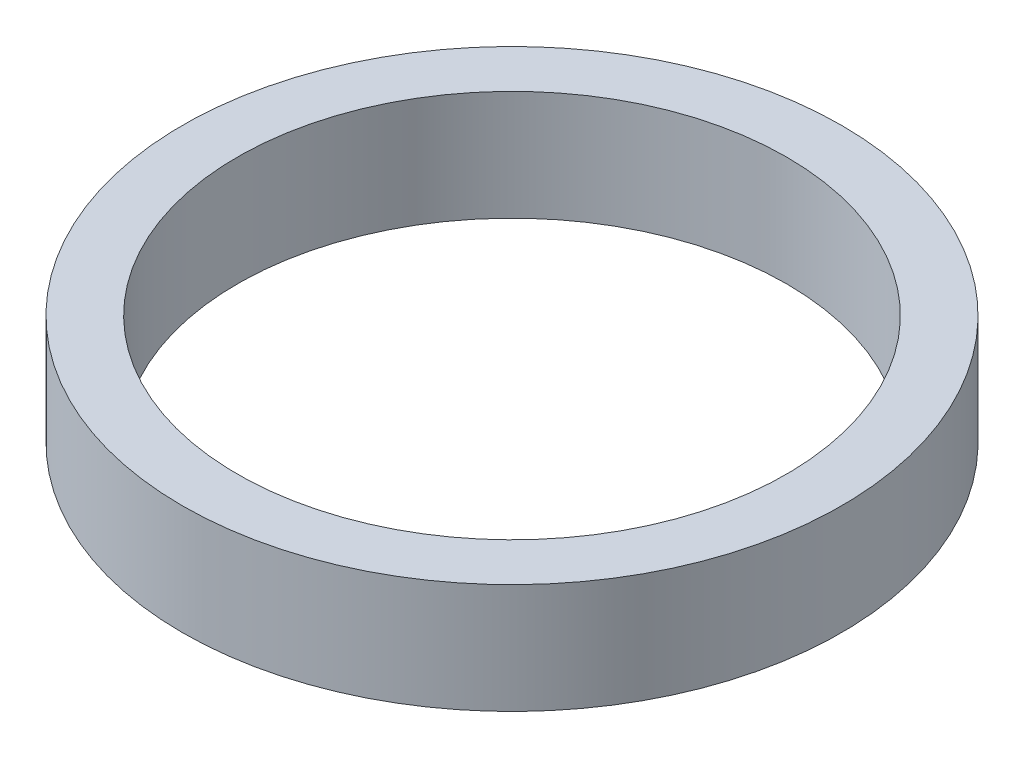
ISO-10303-21;
HEADER;
FILE_DESCRIPTION(('STEP AP214'),'2;1');
FILE_NAME('part.step','',(''),(''),'','','');
FILE_SCHEMA(('AUTOMOTIVE_DESIGN { 1 0 10303 214 1 1 1 1 }'));
ENDSEC;
DATA;
#1=APPLICATION_CONTEXT('core data for automotive mechanical design processes');
#2=APPLICATION_PROTOCOL_DEFINITION('international standard','automotive_design',2000,#1);
#3=PRODUCT_CONTEXT('',#1,'mechanical');
#4=PRODUCT('Part','Part','',(#3));
#5=PRODUCT_RELATED_PRODUCT_CATEGORY('part','',(#4));
#6=PRODUCT_DEFINITION_FORMATION('','',#4);
#7=PRODUCT_DEFINITION_CONTEXT('part definition',#1,'design');
#8=PRODUCT_DEFINITION('design','',#6,#7);
#9=PRODUCT_DEFINITION_SHAPE('','',#8);
#10=(LENGTH_UNIT() NAMED_UNIT(*) SI_UNIT(.MILLI.,.METRE.));
#11=(NAMED_UNIT(*) PLANE_ANGLE_UNIT() SI_UNIT($,.RADIAN.));
#12=(NAMED_UNIT(*) SI_UNIT($,.STERADIAN.) SOLID_ANGLE_UNIT());
#13=UNCERTAINTY_MEASURE_WITH_UNIT(LENGTH_MEASURE(1.E-05),#10,'distance_accuracy_value','');
#14=(GEOMETRIC_REPRESENTATION_CONTEXT(3) GLOBAL_UNCERTAINTY_ASSIGNED_CONTEXT((#13)) GLOBAL_UNIT_ASSIGNED_CONTEXT((#10,
#11,#12)) REPRESENTATION_CONTEXT('',''));
#15=CARTESIAN_POINT('',(0.,0.,0.));
#16=DIRECTION('',(0.,0.,1.));
#17=DIRECTION('',(1.,0.,0.));
#18=AXIS2_PLACEMENT_3D('',#15,#16,#17);
#19=CARTESIAN_POINT('',(0.,5.,0.));
#20=DIRECTION('',(0.,1.,0.));
#21=DIRECTION('',(0.,0.,-1.));
#22=AXIS2_PLACEMENT_3D('',#19,#20,#21);
#23=PLANE('',#22);
#24=CARTESIAN_POINT('',(0.,5.,0.));
#25=DIRECTION('',(0.,-1.,0.));
#26=DIRECTION('',(0.,0.,-1.));
#27=AXIS2_PLACEMENT_3D('',#24,#25,#26);
#28=CIRCLE('',#27,15.);
#29=CARTESIAN_POINT('',(0.,5.,-15.));
#30=VERTEX_POINT('',#29);
#31=EDGE_CURVE('E10',#30,#30,#28,.T.);
#32=ORIENTED_EDGE('',*,*,#31,.F.);
#33=EDGE_LOOP('',(#32));
#34=FACE_BOUND('',#33,.T.);
#35=CARTESIAN_POINT('',(0.,5.,0.));
#36=DIRECTION('',(0.,-1.,0.));
#37=DIRECTION('',(0.,0.,-1.));
#38=AXIS2_PLACEMENT_3D('',#35,#36,#37);
#39=CIRCLE('',#38,12.5);
#40=CARTESIAN_POINT('',(0.,5.,-12.5));
#41=VERTEX_POINT('',#40);
#42=EDGE_CURVE('E46',#41,#41,#39,.T.);
#43=ORIENTED_EDGE('',*,*,#42,.T.);
#44=EDGE_LOOP('',(#43));
#45=FACE_BOUND('',#44,.T.);
#46=ADVANCED_FACE('F35',(#34,#45),#23,.T.);
#47=CARTESIAN_POINT('',(0.,0.,0.));
#48=DIRECTION('',(0.,1.,0.));
#49=DIRECTION('',(0.,0.,-1.));
#50=AXIS2_PLACEMENT_3D('',#47,#48,#49);
#51=PLANE('',#50);
#52=CARTESIAN_POINT('',(0.,0.,0.));
#53=DIRECTION('',(0.,-1.,0.));
#54=DIRECTION('',(0.,0.,-1.));
#55=AXIS2_PLACEMENT_3D('',#52,#53,#54);
#56=CIRCLE('',#55,15.);
#57=CARTESIAN_POINT('',(0.,0.,-15.));
#58=VERTEX_POINT('',#57);
#59=EDGE_CURVE('E39',#58,#58,#56,.T.);
#60=ORIENTED_EDGE('',*,*,#59,.T.);
#61=EDGE_LOOP('',(#60));
#62=FACE_BOUND('',#61,.T.);
#63=CARTESIAN_POINT('',(0.,0.,0.));
#64=DIRECTION('',(0.,-1.,0.));
#65=DIRECTION('',(0.,0.,-1.));
#66=AXIS2_PLACEMENT_3D('',#63,#64,#65);
#67=CIRCLE('',#66,12.5);
#68=CARTESIAN_POINT('',(0.,0.,-12.5));
#69=VERTEX_POINT('',#68);
#70=EDGE_CURVE('E48',#69,#69,#67,.T.);
#71=ORIENTED_EDGE('',*,*,#70,.F.);
#72=EDGE_LOOP('',(#71));
#73=FACE_BOUND('',#72,.T.);
#74=ADVANCED_FACE('F61',(#62,#73),#51,.F.);
#75=CARTESIAN_POINT('',(0.,5.,0.));
#76=DIRECTION('',(0.,-1.,0.));
#77=DIRECTION('',(0.,0.,1.));
#78=AXIS2_PLACEMENT_3D('',#75,#76,#77);
#79=CYLINDRICAL_SURFACE('',#78,15.);
#80=ORIENTED_EDGE('',*,*,#31,.T.);
#81=EDGE_LOOP('',(#80));
#82=FACE_BOUND('',#81,.T.);
#83=ORIENTED_EDGE('',*,*,#59,.F.);
#84=EDGE_LOOP('',(#83));
#85=FACE_BOUND('',#84,.T.);
#86=ADVANCED_FACE('F37',(#82,#85),#79,.T.);
#87=CARTESIAN_POINT('',(0.,5.,0.));
#88=DIRECTION('',(0.,-1.,0.));
#89=DIRECTION('',(0.,0.,1.));
#90=AXIS2_PLACEMENT_3D('',#87,#88,#89);
#91=CYLINDRICAL_SURFACE('',#90,12.5);
#92=ORIENTED_EDGE('',*,*,#42,.F.);
#93=EDGE_LOOP('',(#92));
#94=FACE_BOUND('',#93,.T.);
#95=ORIENTED_EDGE('',*,*,#70,.T.);
#96=EDGE_LOOP('',(#95));
#97=FACE_BOUND('',#96,.T.);
#98=ADVANCED_FACE('F55',(#94,#97),#91,.F.);
#99=CLOSED_SHELL('',(#46,#74,#86,#98));
#100=MANIFOLD_SOLID_BREP('B2',#99);
#101=ADVANCED_BREP_SHAPE_REPRESENTATION('',(#18,#100),#14);
#102=SHAPE_DEFINITION_REPRESENTATION(#9,#101);
ENDSEC;
END-ISO-10303-21;
